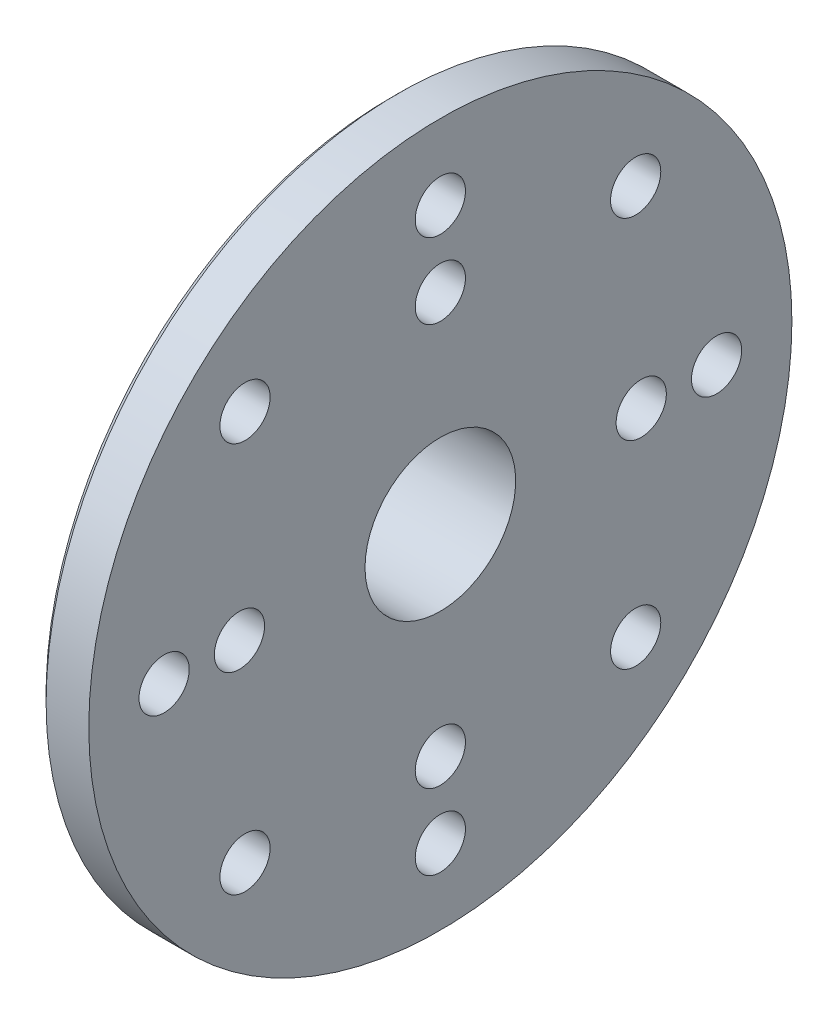
ISO-10303-21;
HEADER;
FILE_DESCRIPTION(('STEP AP214'),'2;1');
FILE_NAME('part.step','',(''),(''),'','','');
FILE_SCHEMA(('AUTOMOTIVE_DESIGN { 1 0 10303 214 1 1 1 1 }'));
ENDSEC;
DATA;
#1=APPLICATION_CONTEXT('core data for automotive mechanical design processes');
#2=APPLICATION_PROTOCOL_DEFINITION('international standard','automotive_design',2000,#1);
#3=PRODUCT_CONTEXT('',#1,'mechanical');
#4=PRODUCT('Part','Part','',(#3));
#5=PRODUCT_RELATED_PRODUCT_CATEGORY('part','',(#4));
#6=PRODUCT_DEFINITION_FORMATION('','',#4);
#7=PRODUCT_DEFINITION_CONTEXT('part definition',#1,'design');
#8=PRODUCT_DEFINITION('design','',#6,#7);
#9=PRODUCT_DEFINITION_SHAPE('','',#8);
#10=(LENGTH_UNIT() NAMED_UNIT(*) SI_UNIT(.MILLI.,.METRE.));
#11=(NAMED_UNIT(*) PLANE_ANGLE_UNIT() SI_UNIT($,.RADIAN.));
#12=(NAMED_UNIT(*) SI_UNIT($,.STERADIAN.) SOLID_ANGLE_UNIT());
#13=UNCERTAINTY_MEASURE_WITH_UNIT(LENGTH_MEASURE(1.E-05),#10,'distance_accuracy_value','');
#14=(GEOMETRIC_REPRESENTATION_CONTEXT(3) GLOBAL_UNCERTAINTY_ASSIGNED_CONTEXT((#13)) GLOBAL_UNIT_ASSIGNED_CONTEXT((#10,
#11,#12)) REPRESENTATION_CONTEXT('',''));
#15=CARTESIAN_POINT('',(0.,0.,0.));
#16=DIRECTION('',(0.,0.,1.));
#17=DIRECTION('',(1.,0.,0.));
#18=AXIS2_PLACEMENT_3D('',#15,#16,#17);
#19=CARTESIAN_POINT('',(-5.,1.5,0.));
#20=DIRECTION('',(1.,0.,0.));
#21=DIRECTION('',(0.,0.,-1.));
#22=AXIS2_PLACEMENT_3D('',#19,#20,#21);
#23=PLANE('',#22);
#24=CARTESIAN_POINT('',(-5.,0.,0.));
#25=DIRECTION('',(1.,0.,0.));
#26=DIRECTION('',(0.,0.,-1.));
#27=AXIS2_PLACEMENT_3D('',#24,#25,#26);
#28=CIRCLE('',#27,3.45000000000001);
#29=CARTESIAN_POINT('',(-5.,0.,-3.45000000000001));
#30=VERTEX_POINT('',#29);
#31=EDGE_CURVE('E10',#30,#30,#28,.F.);
#32=ORIENTED_EDGE('',*,*,#31,.T.);
#33=EDGE_LOOP('',(#32));
#34=FACE_BOUND('',#33,.T.);
#35=CARTESIAN_POINT('',(-5.,0.,0.));
#36=DIRECTION('',(-1.,0.,0.));
#37=DIRECTION('',(0.,0.,1.));
#38=AXIS2_PLACEMENT_3D('',#35,#36,#37);
#39=CIRCLE('',#38,1.5);
#40=CARTESIAN_POINT('',(-5.,0.,1.5));
#41=VERTEX_POINT('',#40);
#42=EDGE_CURVE('E140',#41,#41,#39,.T.);
#43=ORIENTED_EDGE('',*,*,#42,.F.);
#44=EDGE_LOOP('',(#43));
#45=FACE_BOUND('',#44,.T.);
#46=ADVANCED_FACE('F30',(#34,#45),#23,.F.);
#47=CARTESIAN_POINT('',(0.,0.,0.));
#48=DIRECTION('',(-1.,0.,0.));
#49=DIRECTION('',(0.,0.,1.));
#50=AXIS2_PLACEMENT_3D('',#47,#48,#49);
#51=CYLINDRICAL_SURFACE('',#50,3.75);
#52=CARTESIAN_POINT('',(-2.3,0.,0.));
#53=DIRECTION('',(1.,0.,0.));
#54=DIRECTION('',(0.,0.,-1.));
#55=AXIS2_PLACEMENT_3D('',#52,#53,#54);
#56=CIRCLE('',#55,3.75);
#57=CARTESIAN_POINT('',(-2.3,0.,-3.75));
#58=VERTEX_POINT('',#57);
#59=EDGE_CURVE('E77',#58,#58,#56,.F.);
#60=ORIENTED_EDGE('',*,*,#59,.T.);
#61=EDGE_LOOP('',(#60));
#62=FACE_BOUND('',#61,.T.);
#63=CARTESIAN_POINT('',(-4.7,0.,0.));
#64=DIRECTION('',(1.,0.,0.));
#65=DIRECTION('',(0.,0.,-1.));
#66=AXIS2_PLACEMENT_3D('',#63,#64,#65);
#67=CIRCLE('',#66,3.75);
#68=CARTESIAN_POINT('',(-4.7,0.,-3.75));
#69=VERTEX_POINT('',#68);
#70=EDGE_CURVE('E80',#69,#69,#67,.T.);
#71=ORIENTED_EDGE('',*,*,#70,.T.);
#72=EDGE_LOOP('',(#71));
#73=FACE_BOUND('',#72,.T.);
#74=ADVANCED_FACE('F233',(#62,#73),#51,.T.);
#75=CARTESIAN_POINT('',(-2.,3.75,0.));
#76=DIRECTION('',(1.,0.,0.));
#77=DIRECTION('',(0.,0.,-1.));
#78=AXIS2_PLACEMENT_3D('',#75,#76,#77);
#79=PLANE('',#78);
#80=CARTESIAN_POINT('',(-2.,0.,0.));
#81=DIRECTION('',(1.,0.,0.));
#82=DIRECTION('',(0.,0.,-1.));
#83=AXIS2_PLACEMENT_3D('',#80,#81,#82);
#84=CIRCLE('',#83,13.7);
#85=CARTESIAN_POINT('',(-2.,0.,-13.7));
#86=VERTEX_POINT('',#85);
#87=EDGE_CURVE('E86',#86,#86,#84,.F.);
#88=ORIENTED_EDGE('',*,*,#87,.T.);
#89=EDGE_LOOP('',(#88));
#90=FACE_BOUND('',#89,.T.);
#91=CARTESIAN_POINT('',(-2.,0.,0.));
#92=DIRECTION('',(1.,0.,0.));
#93=DIRECTION('',(0.,0.,-1.));
#94=AXIS2_PLACEMENT_3D('',#91,#92,#93);
#95=CIRCLE('',#94,4.05);
#96=CARTESIAN_POINT('',(-2.,0.,-4.05));
#97=VERTEX_POINT('',#96);
#98=EDGE_CURVE('E89',#97,#97,#95,.T.);
#99=ORIENTED_EDGE('',*,*,#98,.T.);
#100=EDGE_LOOP('',(#99));
#101=FACE_BOUND('',#100,.T.);
#102=CARTESIAN_POINT('',(-2.,11.,0.));
#103=DIRECTION('',(1.,0.,0.));
#104=DIRECTION('',(0.,0.,-1.));
#105=AXIS2_PLACEMENT_3D('',#102,#103,#104);
#106=CIRCLE('',#105,1.3);
#107=CARTESIAN_POINT('',(-2.,11.,-1.3));
#108=VERTEX_POINT('',#107);
#109=EDGE_CURVE('E92',#108,#108,#106,.T.);
#110=ORIENTED_EDGE('',*,*,#109,.T.);
#111=EDGE_LOOP('',(#110));
#112=FACE_BOUND('',#111,.T.);
#113=CARTESIAN_POINT('',(-2.,7.77817459305201,-7.77817459305204));
#114=DIRECTION('',(1.,0.,0.));
#115=DIRECTION('',(0.,0.,-1.));
#116=AXIS2_PLACEMENT_3D('',#113,#114,#115);
#117=CIRCLE('',#116,1.3);
#118=CARTESIAN_POINT('',(-2.,7.77817459305201,-9.07817459305203));
#119=VERTEX_POINT('',#118);
#120=EDGE_CURVE('E95',#119,#119,#117,.T.);
#121=ORIENTED_EDGE('',*,*,#120,.T.);
#122=EDGE_LOOP('',(#121));
#123=FACE_BOUND('',#122,.T.);
#124=CARTESIAN_POINT('',(-2.,0.,-11.));
#125=DIRECTION('',(1.,0.,0.));
#126=DIRECTION('',(0.,0.,-1.));
#127=AXIS2_PLACEMENT_3D('',#124,#125,#126);
#128=CIRCLE('',#127,1.30000000000001);
#129=CARTESIAN_POINT('',(-2.,0.,-12.3));
#130=VERTEX_POINT('',#129);
#131=EDGE_CURVE('E98',#130,#130,#128,.T.);
#132=ORIENTED_EDGE('',*,*,#131,.T.);
#133=EDGE_LOOP('',(#132));
#134=FACE_BOUND('',#133,.T.);
#135=CARTESIAN_POINT('',(-2.,-7.77817459305206,-7.77817459305198));
#136=DIRECTION('',(1.,0.,0.));
#137=DIRECTION('',(0.,0.,-1.));
#138=AXIS2_PLACEMENT_3D('',#135,#136,#137);
#139=CIRCLE('',#138,1.3);
#140=CARTESIAN_POINT('',(-2.,-7.77817459305206,-9.07817459305198));
#141=VERTEX_POINT('',#140);
#142=EDGE_CURVE('E101',#141,#141,#139,.T.);
#143=ORIENTED_EDGE('',*,*,#142,.T.);
#144=EDGE_LOOP('',(#143));
#145=FACE_BOUND('',#144,.T.);
#146=CARTESIAN_POINT('',(-2.,-11.,0.));
#147=DIRECTION('',(1.,0.,0.));
#148=DIRECTION('',(0.,0.,-1.));
#149=AXIS2_PLACEMENT_3D('',#146,#147,#148);
#150=CIRCLE('',#149,1.3);
#151=CARTESIAN_POINT('',(-2.,-11.,-1.3));
#152=VERTEX_POINT('',#151);
#153=EDGE_CURVE('E104',#152,#152,#150,.T.);
#154=ORIENTED_EDGE('',*,*,#153,.T.);
#155=EDGE_LOOP('',(#154));
#156=FACE_BOUND('',#155,.T.);
#157=CARTESIAN_POINT('',(-2.,-7.77817459305195,7.77817459305209));
#158=DIRECTION('',(1.,0.,0.));
#159=DIRECTION('',(0.,0.,-1.));
#160=AXIS2_PLACEMENT_3D('',#157,#158,#159);
#161=CIRCLE('',#160,1.30000000000001);
#162=CARTESIAN_POINT('',(-2.,-7.77817459305195,6.47817459305208));
#163=VERTEX_POINT('',#162);
#164=EDGE_CURVE('E107',#163,#163,#161,.T.);
#165=ORIENTED_EDGE('',*,*,#164,.T.);
#166=EDGE_LOOP('',(#165));
#167=FACE_BOUND('',#166,.T.);
#168=CARTESIAN_POINT('',(-2.,1.15218884181823E-13,11.));
#169=DIRECTION('',(1.,0.,0.));
#170=DIRECTION('',(0.,0.,-1.));
#171=AXIS2_PLACEMENT_3D('',#168,#169,#170);
#172=CIRCLE('',#171,1.30000000000001);
#173=CARTESIAN_POINT('',(-2.,1.15218884181823E-13,9.69999999999999));
#174=VERTEX_POINT('',#173);
#175=EDGE_CURVE('E110',#174,#174,#172,.T.);
#176=ORIENTED_EDGE('',*,*,#175,.T.);
#177=EDGE_LOOP('',(#176));
#178=FACE_BOUND('',#177,.T.);
#179=CARTESIAN_POINT('',(-2.,7.77817459305212,7.77817459305193));
#180=DIRECTION('',(1.,0.,0.));
#181=DIRECTION('',(0.,0.,-1.));
#182=AXIS2_PLACEMENT_3D('',#179,#180,#181);
#183=CIRCLE('',#182,1.3);
#184=CARTESIAN_POINT('',(-2.,7.77817459305212,6.47817459305193));
#185=VERTEX_POINT('',#184);
#186=EDGE_CURVE('E113',#185,#185,#183,.T.);
#187=ORIENTED_EDGE('',*,*,#186,.T.);
#188=EDGE_LOOP('',(#187));
#189=FACE_BOUND('',#188,.T.);
#190=CARTESIAN_POINT('',(-2.,8.,0.));
#191=DIRECTION('',(1.,0.,0.));
#192=DIRECTION('',(0.,0.,-1.));
#193=AXIS2_PLACEMENT_3D('',#190,#191,#192);
#194=CIRCLE('',#193,1.3);
#195=CARTESIAN_POINT('',(-2.,8.,-1.3));
#196=VERTEX_POINT('',#195);
#197=EDGE_CURVE('E116',#196,#196,#194,.T.);
#198=ORIENTED_EDGE('',*,*,#197,.T.);
#199=EDGE_LOOP('',(#198));
#200=FACE_BOUND('',#199,.T.);
#201=CARTESIAN_POINT('',(-2.,0.,-8.));
#202=DIRECTION('',(1.,0.,0.));
#203=DIRECTION('',(0.,0.,-1.));
#204=AXIS2_PLACEMENT_3D('',#201,#202,#203);
#205=CIRCLE('',#204,1.3);
#206=CARTESIAN_POINT('',(-2.,0.,-9.3));
#207=VERTEX_POINT('',#206);
#208=EDGE_CURVE('E119',#207,#207,#205,.T.);
#209=ORIENTED_EDGE('',*,*,#208,.T.);
#210=EDGE_LOOP('',(#209));
#211=FACE_BOUND('',#210,.T.);
#212=CARTESIAN_POINT('',(-2.,-8.,0.));
#213=DIRECTION('',(1.,0.,0.));
#214=DIRECTION('',(0.,0.,-1.));
#215=AXIS2_PLACEMENT_3D('',#212,#213,#214);
#216=CIRCLE('',#215,1.3);
#217=CARTESIAN_POINT('',(-2.,-8.,-1.3));
#218=VERTEX_POINT('',#217);
#219=EDGE_CURVE('E122',#218,#218,#216,.T.);
#220=ORIENTED_EDGE('',*,*,#219,.T.);
#221=EDGE_LOOP('',(#220));
#222=FACE_BOUND('',#221,.T.);
#223=CARTESIAN_POINT('',(-2.,0.,8.));
#224=DIRECTION('',(1.,0.,0.));
#225=DIRECTION('',(0.,0.,-1.));
#226=AXIS2_PLACEMENT_3D('',#223,#224,#225);
#227=CIRCLE('',#226,1.3);
#228=CARTESIAN_POINT('',(-2.,0.,6.7));
#229=VERTEX_POINT('',#228);
#230=EDGE_CURVE('E125',#229,#229,#227,.T.);
#231=ORIENTED_EDGE('',*,*,#230,.T.);
#232=EDGE_LOOP('',(#231));
#233=FACE_BOUND('',#232,.T.);
#234=ADVANCED_FACE('F238',(#90,#101,#112,#123,#134,#145,#156,#167,#178,#189,#200,#211,#222,
#233),#79,.F.);
#235=CARTESIAN_POINT('',(0.,0.,0.));
#236=DIRECTION('',(-1.,0.,0.));
#237=DIRECTION('',(0.,0.,1.));
#238=AXIS2_PLACEMENT_3D('',#235,#236,#237);
#239=CYLINDRICAL_SURFACE('',#238,14.);
#240=CARTESIAN_POINT('',(-1.7,0.,0.));
#241=DIRECTION('',(1.,0.,0.));
#242=DIRECTION('',(0.,0.,-1.));
#243=AXIS2_PLACEMENT_3D('',#240,#241,#242);
#244=CIRCLE('',#243,14.);
#245=CARTESIAN_POINT('',(-1.7,0.,-14.));
#246=VERTEX_POINT('',#245);
#247=EDGE_CURVE('E83',#246,#246,#244,.T.);
#248=ORIENTED_EDGE('',*,*,#247,.T.);
#249=EDGE_LOOP('',(#248));
#250=FACE_BOUND('',#249,.T.);
#251=CARTESIAN_POINT('',(0.,0.,0.));
#252=DIRECTION('',(-1.,0.,0.));
#253=DIRECTION('',(0.,0.,1.));
#254=AXIS2_PLACEMENT_3D('',#251,#252,#253);
#255=CIRCLE('',#254,14.);
#256=CARTESIAN_POINT('',(0.,0.,14.));
#257=VERTEX_POINT('',#256);
#258=EDGE_CURVE('E128',#257,#257,#255,.T.);
#259=ORIENTED_EDGE('',*,*,#258,.T.);
#260=EDGE_LOOP('',(#259));
#261=FACE_BOUND('',#260,.T.);
#262=ADVANCED_FACE('F186',(#250,#261),#239,.T.);
#263=CARTESIAN_POINT('',(0.,14.,0.));
#264=DIRECTION('',(-1.,0.,0.));
#265=DIRECTION('',(0.,0.,1.));
#266=AXIS2_PLACEMENT_3D('',#263,#264,#265);
#267=PLANE('',#266);
#268=CARTESIAN_POINT('',(0.,0.,8.));
#269=DIRECTION('',(1.,0.,0.));
#270=DIRECTION('',(0.,1.,0.));
#271=AXIS2_PLACEMENT_3D('',#268,#269,#270);
#272=CIRCLE('',#271,1.);
#273=CARTESIAN_POINT('',(0.,1.00000000000008,7.99999999999999));
#274=VERTEX_POINT('',#273);
#275=EDGE_CURVE('E176',#274,#274,#272,.T.);
#276=ORIENTED_EDGE('',*,*,#275,.F.);
#277=EDGE_LOOP('',(#276));
#278=FACE_BOUND('',#277,.T.);
#279=CARTESIAN_POINT('',(0.,-8.,0.));
#280=DIRECTION('',(1.,0.,0.));
#281=DIRECTION('',(0.,0.,1.));
#282=AXIS2_PLACEMENT_3D('',#279,#280,#281);
#283=CIRCLE('',#282,1.);
#284=CARTESIAN_POINT('',(0.,-8.,1.));
#285=VERTEX_POINT('',#284);
#286=EDGE_CURVE('E173',#285,#285,#283,.T.);
#287=ORIENTED_EDGE('',*,*,#286,.F.);
#288=EDGE_LOOP('',(#287));
#289=FACE_BOUND('',#288,.T.);
#290=CARTESIAN_POINT('',(0.,0.,-8.));
#291=DIRECTION('',(1.,0.,0.));
#292=DIRECTION('',(0.,-1.,0.));
#293=AXIS2_PLACEMENT_3D('',#290,#291,#292);
#294=CIRCLE('',#293,1.);
#295=CARTESIAN_POINT('',(0.,-1.00000000000003,-8.));
#296=VERTEX_POINT('',#295);
#297=EDGE_CURVE('E170',#296,#296,#294,.T.);
#298=ORIENTED_EDGE('',*,*,#297,.F.);
#299=EDGE_LOOP('',(#298));
#300=FACE_BOUND('',#299,.T.);
#301=CARTESIAN_POINT('',(0.,8.,0.));
#302=DIRECTION('',(1.,0.,0.));
#303=DIRECTION('',(0.,0.,-1.));
#304=AXIS2_PLACEMENT_3D('',#301,#302,#303);
#305=CIRCLE('',#304,1.);
#306=CARTESIAN_POINT('',(0.,8.,-1.));
#307=VERTEX_POINT('',#306);
#308=EDGE_CURVE('E167',#307,#307,#305,.T.);
#309=ORIENTED_EDGE('',*,*,#308,.F.);
#310=EDGE_LOOP('',(#309));
#311=FACE_BOUND('',#310,.T.);
#312=CARTESIAN_POINT('',(0.,7.77817459305212,7.77817459305193));
#313=DIRECTION('',(1.,0.,0.));
#314=DIRECTION('',(0.,0.707106781186539,-0.707106781186556));
#315=AXIS2_PLACEMENT_3D('',#312,#313,#314);
#316=CIRCLE('',#315,1.);
#317=CARTESIAN_POINT('',(0.,8.48528137423866,7.07106781186537));
#318=VERTEX_POINT('',#317);
#319=EDGE_CURVE('E164',#318,#318,#316,.T.);
#320=ORIENTED_EDGE('',*,*,#319,.F.);
#321=EDGE_LOOP('',(#320));
#322=FACE_BOUND('',#321,.T.);
#323=CARTESIAN_POINT('',(0.,1.15218884181823E-13,11.));
#324=DIRECTION('',(1.,0.,0.));
#325=DIRECTION('',(0.,1.,0.));
#326=AXIS2_PLACEMENT_3D('',#323,#324,#325);
#327=CIRCLE('',#326,1.);
#328=CARTESIAN_POINT('',(0.,1.00000000000012,11.));
#329=VERTEX_POINT('',#328);
#330=EDGE_CURVE('E161',#329,#329,#327,.T.);
#331=ORIENTED_EDGE('',*,*,#330,.F.);
#332=EDGE_LOOP('',(#331));
#333=FACE_BOUND('',#332,.T.);
#334=CARTESIAN_POINT('',(0.,-7.77817459305195,7.77817459305209));
#335=DIRECTION('',(1.,0.,0.));
#336=DIRECTION('',(0.,0.707106781186554,0.707106781186541));
#337=AXIS2_PLACEMENT_3D('',#334,#335,#336);
#338=CIRCLE('',#337,1.);
#339=CARTESIAN_POINT('',(0.,-7.0710678118654,8.48528137423863));
#340=VERTEX_POINT('',#339);
#341=EDGE_CURVE('E158',#340,#340,#338,.T.);
#342=ORIENTED_EDGE('',*,*,#341,.F.);
#343=EDGE_LOOP('',(#342));
#344=FACE_BOUND('',#343,.T.);
#345=CARTESIAN_POINT('',(0.,-11.,0.));
#346=DIRECTION('',(1.,0.,0.));
#347=DIRECTION('',(0.,0.,1.));
#348=AXIS2_PLACEMENT_3D('',#345,#346,#347);
#349=CIRCLE('',#348,1.);
#350=CARTESIAN_POINT('',(0.,-11.,1.));
#351=VERTEX_POINT('',#350);
#352=EDGE_CURVE('E155',#351,#351,#349,.T.);
#353=ORIENTED_EDGE('',*,*,#352,.F.);
#354=EDGE_LOOP('',(#353));
#355=FACE_BOUND('',#354,.T.);
#356=CARTESIAN_POINT('',(0.,-7.77817459305206,-7.77817459305198));
#357=DIRECTION('',(1.,0.,0.));
#358=DIRECTION('',(0.,-0.707106781186544,0.707106781186551));
#359=AXIS2_PLACEMENT_3D('',#356,#357,#358);
#360=CIRCLE('',#359,1.);
#361=CARTESIAN_POINT('',(0.,-8.48528137423861,-7.07106781186543));
#362=VERTEX_POINT('',#361);
#363=EDGE_CURVE('E152',#362,#362,#360,.T.);
#364=ORIENTED_EDGE('',*,*,#363,.F.);
#365=EDGE_LOOP('',(#364));
#366=FACE_BOUND('',#365,.T.);
#367=CARTESIAN_POINT('',(0.,0.,-11.));
#368=DIRECTION('',(1.,0.,0.));
#369=DIRECTION('',(0.,-1.,0.));
#370=AXIS2_PLACEMENT_3D('',#367,#368,#369);
#371=CIRCLE('',#370,1.);
#372=CARTESIAN_POINT('',(0.,-1.00000000000004,-11.));
#373=VERTEX_POINT('',#372);
#374=EDGE_CURVE('E149',#373,#373,#371,.T.);
#375=ORIENTED_EDGE('',*,*,#374,.F.);
#376=EDGE_LOOP('',(#375));
#377=FACE_BOUND('',#376,.T.);
#378=CARTESIAN_POINT('',(0.,7.77817459305201,-7.77817459305204));
#379=DIRECTION('',(1.,0.,0.));
#380=DIRECTION('',(0.,-0.707106781186549,-0.707106781186546));
#381=AXIS2_PLACEMENT_3D('',#378,#379,#380);
#382=CIRCLE('',#381,1.);
#383=CARTESIAN_POINT('',(0.,7.07106781186546,-8.48528137423858));
#384=VERTEX_POINT('',#383);
#385=EDGE_CURVE('E146',#384,#384,#382,.T.);
#386=ORIENTED_EDGE('',*,*,#385,.F.);
#387=EDGE_LOOP('',(#386));
#388=FACE_BOUND('',#387,.T.);
#389=CARTESIAN_POINT('',(0.,11.,0.));
#390=DIRECTION('',(1.,0.,0.));
#391=DIRECTION('',(0.,0.,-1.));
#392=AXIS2_PLACEMENT_3D('',#389,#390,#391);
#393=CIRCLE('',#392,1.);
#394=CARTESIAN_POINT('',(0.,11.,-1.));
#395=VERTEX_POINT('',#394);
#396=EDGE_CURVE('E143',#395,#395,#393,.T.);
#397=ORIENTED_EDGE('',*,*,#396,.F.);
#398=EDGE_LOOP('',(#397));
#399=FACE_BOUND('',#398,.T.);
#400=ORIENTED_EDGE('',*,*,#258,.F.);
#401=EDGE_LOOP('',(#400));
#402=FACE_BOUND('',#401,.T.);
#403=CARTESIAN_POINT('',(0.,0.,0.));
#404=DIRECTION('',(-1.,0.,0.));
#405=DIRECTION('',(0.,0.,1.));
#406=AXIS2_PLACEMENT_3D('',#403,#404,#405);
#407=CIRCLE('',#406,3.);
#408=CARTESIAN_POINT('',(0.,0.,3.));
#409=VERTEX_POINT('',#408);
#410=EDGE_CURVE('E131',#409,#409,#407,.T.);
#411=ORIENTED_EDGE('',*,*,#410,.T.);
#412=EDGE_LOOP('',(#411));
#413=FACE_BOUND('',#412,.T.);
#414=ADVANCED_FACE('F182',(#278,#289,#300,#311,#322,#333,#344,#355,#366,#377,#388,#399,#402,
#413),#267,.F.);
#415=CARTESIAN_POINT('',(0.,0.,0.));
#416=DIRECTION('',(-1.,0.,0.));
#417=DIRECTION('',(0.,0.,1.));
#418=AXIS2_PLACEMENT_3D('',#415,#416,#417);
#419=CYLINDRICAL_SURFACE('',#418,3.);
#420=ORIENTED_EDGE('',*,*,#410,.F.);
#421=EDGE_LOOP('',(#420));
#422=FACE_BOUND('',#421,.T.);
#423=CARTESIAN_POINT('',(-4.5,0.,0.));
#424=DIRECTION('',(-1.,0.,0.));
#425=DIRECTION('',(0.,0.,1.));
#426=AXIS2_PLACEMENT_3D('',#423,#424,#425);
#427=CIRCLE('',#426,3.);
#428=CARTESIAN_POINT('',(-4.5,0.,3.));
#429=VERTEX_POINT('',#428);
#430=EDGE_CURVE('E134',#429,#429,#427,.T.);
#431=ORIENTED_EDGE('',*,*,#430,.T.);
#432=EDGE_LOOP('',(#431));
#433=FACE_BOUND('',#432,.T.);
#434=ADVANCED_FACE('F185',(#422,#433),#419,.F.);
#435=CARTESIAN_POINT('',(-4.5,3.,0.));
#436=DIRECTION('',(-1.,0.,0.));
#437=DIRECTION('',(0.,0.,1.));
#438=AXIS2_PLACEMENT_3D('',#435,#436,#437);
#439=PLANE('',#438);
#440=ORIENTED_EDGE('',*,*,#430,.F.);
#441=EDGE_LOOP('',(#440));
#442=FACE_BOUND('',#441,.T.);
#443=CARTESIAN_POINT('',(-4.5,0.,0.));
#444=DIRECTION('',(-1.,0.,0.));
#445=DIRECTION('',(0.,0.,1.));
#446=AXIS2_PLACEMENT_3D('',#443,#444,#445);
#447=CIRCLE('',#446,1.5);
#448=CARTESIAN_POINT('',(-4.5,0.,1.5));
#449=VERTEX_POINT('',#448);
#450=EDGE_CURVE('E137',#449,#449,#447,.T.);
#451=ORIENTED_EDGE('',*,*,#450,.T.);
#452=EDGE_LOOP('',(#451));
#453=FACE_BOUND('',#452,.T.);
#454=ADVANCED_FACE('F216',(#442,#453),#439,.F.);
#455=CARTESIAN_POINT('',(0.,0.,0.));
#456=DIRECTION('',(-1.,0.,0.));
#457=DIRECTION('',(0.,0.,1.));
#458=AXIS2_PLACEMENT_3D('',#455,#456,#457);
#459=CYLINDRICAL_SURFACE('',#458,1.5);
#460=ORIENTED_EDGE('',*,*,#450,.F.);
#461=EDGE_LOOP('',(#460));
#462=FACE_BOUND('',#461,.T.);
#463=ORIENTED_EDGE('',*,*,#42,.T.);
#464=EDGE_LOOP('',(#463));
#465=FACE_BOUND('',#464,.T.);
#466=ADVANCED_FACE('F222',(#462,#465),#459,.F.);
#467=CARTESIAN_POINT('',(-5.,11.,0.));
#468=DIRECTION('',(1.,0.,0.));
#469=DIRECTION('',(0.,0.,-1.));
#470=AXIS2_PLACEMENT_3D('',#467,#468,#469);
#471=CYLINDRICAL_SURFACE('',#470,1.);
#472=CARTESIAN_POINT('',(-1.7,11.,0.));
#473=DIRECTION('',(1.,0.,0.));
#474=DIRECTION('',(0.,0.,-1.));
#475=AXIS2_PLACEMENT_3D('',#472,#473,#474);
#476=CIRCLE('',#475,1.);
#477=CARTESIAN_POINT('',(-1.7,11.,-1.));
#478=VERTEX_POINT('',#477);
#479=EDGE_CURVE('E74',#478,#478,#476,.F.);
#480=ORIENTED_EDGE('',*,*,#479,.T.);
#481=EDGE_LOOP('',(#480));
#482=FACE_BOUND('',#481,.T.);
#483=ORIENTED_EDGE('',*,*,#396,.T.);
#484=EDGE_LOOP('',(#483));
#485=FACE_BOUND('',#484,.T.);
#486=ADVANCED_FACE('F228',(#482,#485),#471,.F.);
#487=CARTESIAN_POINT('',(-5.,7.77817459305201,-7.77817459305204));
#488=DIRECTION('',(1.,0.,0.));
#489=DIRECTION('',(0.,0.,-1.));
#490=AXIS2_PLACEMENT_3D('',#487,#488,#489);
#491=CYLINDRICAL_SURFACE('',#490,1.);
#492=CARTESIAN_POINT('',(-1.7,7.77817459305201,-7.77817459305204));
#493=DIRECTION('',(1.,0.,0.));
#494=DIRECTION('',(0.,0.,-1.));
#495=AXIS2_PLACEMENT_3D('',#492,#493,#494);
#496=CIRCLE('',#495,1.);
#497=CARTESIAN_POINT('',(-1.7,7.77817459305201,-8.77817459305204));
#498=VERTEX_POINT('',#497);
#499=EDGE_CURVE('E71',#498,#498,#496,.F.);
#500=ORIENTED_EDGE('',*,*,#499,.T.);
#501=EDGE_LOOP('',(#500));
#502=FACE_BOUND('',#501,.T.);
#503=ORIENTED_EDGE('',*,*,#385,.T.);
#504=EDGE_LOOP('',(#503));
#505=FACE_BOUND('',#504,.T.);
#506=ADVANCED_FACE('F315',(#502,#505),#491,.F.);
#507=CARTESIAN_POINT('',(-5.,0.,-11.));
#508=DIRECTION('',(1.,0.,0.));
#509=DIRECTION('',(0.,0.,-1.));
#510=AXIS2_PLACEMENT_3D('',#507,#508,#509);
#511=CYLINDRICAL_SURFACE('',#510,1.);
#512=CARTESIAN_POINT('',(-1.69999999999999,0.,-11.));
#513=DIRECTION('',(1.,0.,0.));
#514=DIRECTION('',(0.,0.,-1.));
#515=AXIS2_PLACEMENT_3D('',#512,#513,#514);
#516=CIRCLE('',#515,1.);
#517=CARTESIAN_POINT('',(-1.69999999999999,0.,-12.));
#518=VERTEX_POINT('',#517);
#519=EDGE_CURVE('E68',#518,#518,#516,.F.);
#520=ORIENTED_EDGE('',*,*,#519,.T.);
#521=EDGE_LOOP('',(#520));
#522=FACE_BOUND('',#521,.T.);
#523=ORIENTED_EDGE('',*,*,#374,.T.);
#524=EDGE_LOOP('',(#523));
#525=FACE_BOUND('',#524,.T.);
#526=ADVANCED_FACE('F319',(#522,#525),#511,.F.);
#527=CARTESIAN_POINT('',(-5.,-7.77817459305206,-7.77817459305198));
#528=DIRECTION('',(1.,0.,0.));
#529=DIRECTION('',(0.,0.,-1.));
#530=AXIS2_PLACEMENT_3D('',#527,#528,#529);
#531=CYLINDRICAL_SURFACE('',#530,1.);
#532=CARTESIAN_POINT('',(-1.7,-7.77817459305206,-7.77817459305198));
#533=DIRECTION('',(1.,0.,0.));
#534=DIRECTION('',(0.,0.,-1.));
#535=AXIS2_PLACEMENT_3D('',#532,#533,#534);
#536=CIRCLE('',#535,1.);
#537=CARTESIAN_POINT('',(-1.7,-7.77817459305206,-8.77817459305198));
#538=VERTEX_POINT('',#537);
#539=EDGE_CURVE('E65',#538,#538,#536,.F.);
#540=ORIENTED_EDGE('',*,*,#539,.T.);
#541=EDGE_LOOP('',(#540));
#542=FACE_BOUND('',#541,.T.);
#543=ORIENTED_EDGE('',*,*,#363,.T.);
#544=EDGE_LOOP('',(#543));
#545=FACE_BOUND('',#544,.T.);
#546=ADVANCED_FACE('F323',(#542,#545),#531,.F.);
#547=CARTESIAN_POINT('',(-5.,-11.,0.));
#548=DIRECTION('',(1.,0.,0.));
#549=DIRECTION('',(0.,0.,-1.));
#550=AXIS2_PLACEMENT_3D('',#547,#548,#549);
#551=CYLINDRICAL_SURFACE('',#550,1.);
#552=CARTESIAN_POINT('',(-1.7,-11.,0.));
#553=DIRECTION('',(1.,0.,0.));
#554=DIRECTION('',(0.,0.,-1.));
#555=AXIS2_PLACEMENT_3D('',#552,#553,#554);
#556=CIRCLE('',#555,1.);
#557=CARTESIAN_POINT('',(-1.7,-11.,-1.));
#558=VERTEX_POINT('',#557);
#559=EDGE_CURVE('E62',#558,#558,#556,.F.);
#560=ORIENTED_EDGE('',*,*,#559,.T.);
#561=EDGE_LOOP('',(#560));
#562=FACE_BOUND('',#561,.T.);
#563=ORIENTED_EDGE('',*,*,#352,.T.);
#564=EDGE_LOOP('',(#563));
#565=FACE_BOUND('',#564,.T.);
#566=ADVANCED_FACE('F327',(#562,#565),#551,.F.);
#567=CARTESIAN_POINT('',(-5.,-7.77817459305195,7.77817459305209));
#568=DIRECTION('',(1.,0.,0.));
#569=DIRECTION('',(0.,0.,-1.));
#570=AXIS2_PLACEMENT_3D('',#567,#568,#569);
#571=CYLINDRICAL_SURFACE('',#570,1.);
#572=CARTESIAN_POINT('',(-1.69999999999999,-7.77817459305195,7.77817459305209));
#573=DIRECTION('',(1.,0.,0.));
#574=DIRECTION('',(0.,0.,-1.));
#575=AXIS2_PLACEMENT_3D('',#572,#573,#574);
#576=CIRCLE('',#575,1.);
#577=CARTESIAN_POINT('',(-1.69999999999999,-7.77817459305195,6.77817459305209));
#578=VERTEX_POINT('',#577);
#579=EDGE_CURVE('E59',#578,#578,#576,.F.);
#580=ORIENTED_EDGE('',*,*,#579,.T.);
#581=EDGE_LOOP('',(#580));
#582=FACE_BOUND('',#581,.T.);
#583=ORIENTED_EDGE('',*,*,#341,.T.);
#584=EDGE_LOOP('',(#583));
#585=FACE_BOUND('',#584,.T.);
#586=ADVANCED_FACE('F331',(#582,#585),#571,.F.);
#587=CARTESIAN_POINT('',(-5.,1.15218884181823E-13,11.));
#588=DIRECTION('',(1.,0.,0.));
#589=DIRECTION('',(0.,0.,-1.));
#590=AXIS2_PLACEMENT_3D('',#587,#588,#589);
#591=CYLINDRICAL_SURFACE('',#590,1.);
#592=CARTESIAN_POINT('',(-1.69999999999999,1.15218884181823E-13,11.));
#593=DIRECTION('',(1.,0.,0.));
#594=DIRECTION('',(0.,0.,-1.));
#595=AXIS2_PLACEMENT_3D('',#592,#593,#594);
#596=CIRCLE('',#595,1.);
#597=CARTESIAN_POINT('',(-1.69999999999999,1.15218884181823E-13,10.));
#598=VERTEX_POINT('',#597);
#599=EDGE_CURVE('E56',#598,#598,#596,.F.);
#600=ORIENTED_EDGE('',*,*,#599,.T.);
#601=EDGE_LOOP('',(#600));
#602=FACE_BOUND('',#601,.T.);
#603=ORIENTED_EDGE('',*,*,#330,.T.);
#604=EDGE_LOOP('',(#603));
#605=FACE_BOUND('',#604,.T.);
#606=ADVANCED_FACE('F335',(#602,#605),#591,.F.);
#607=CARTESIAN_POINT('',(-5.,7.77817459305212,7.77817459305193));
#608=DIRECTION('',(1.,0.,0.));
#609=DIRECTION('',(0.,0.,-1.));
#610=AXIS2_PLACEMENT_3D('',#607,#608,#609);
#611=CYLINDRICAL_SURFACE('',#610,1.);
#612=CARTESIAN_POINT('',(-1.7,7.77817459305212,7.77817459305193));
#613=DIRECTION('',(1.,0.,0.));
#614=DIRECTION('',(0.,0.,-1.));
#615=AXIS2_PLACEMENT_3D('',#612,#613,#614);
#616=CIRCLE('',#615,1.);
#617=CARTESIAN_POINT('',(-1.7,7.77817459305212,6.77817459305193));
#618=VERTEX_POINT('',#617);
#619=EDGE_CURVE('E53',#618,#618,#616,.F.);
#620=ORIENTED_EDGE('',*,*,#619,.T.);
#621=EDGE_LOOP('',(#620));
#622=FACE_BOUND('',#621,.T.);
#623=ORIENTED_EDGE('',*,*,#319,.T.);
#624=EDGE_LOOP('',(#623));
#625=FACE_BOUND('',#624,.T.);
#626=ADVANCED_FACE('F339',(#622,#625),#611,.F.);
#627=CARTESIAN_POINT('',(-5.,8.,0.));
#628=DIRECTION('',(1.,0.,0.));
#629=DIRECTION('',(0.,0.,-1.));
#630=AXIS2_PLACEMENT_3D('',#627,#628,#629);
#631=CYLINDRICAL_SURFACE('',#630,1.);
#632=CARTESIAN_POINT('',(-1.7,8.,0.));
#633=DIRECTION('',(1.,0.,0.));
#634=DIRECTION('',(0.,0.,-1.));
#635=AXIS2_PLACEMENT_3D('',#632,#633,#634);
#636=CIRCLE('',#635,1.);
#637=CARTESIAN_POINT('',(-1.7,8.,-1.));
#638=VERTEX_POINT('',#637);
#639=EDGE_CURVE('E50',#638,#638,#636,.F.);
#640=ORIENTED_EDGE('',*,*,#639,.T.);
#641=EDGE_LOOP('',(#640));
#642=FACE_BOUND('',#641,.T.);
#643=ORIENTED_EDGE('',*,*,#308,.T.);
#644=EDGE_LOOP('',(#643));
#645=FACE_BOUND('',#644,.T.);
#646=ADVANCED_FACE('F343',(#642,#645),#631,.F.);
#647=CARTESIAN_POINT('',(-5.,0.,-8.));
#648=DIRECTION('',(1.,0.,0.));
#649=DIRECTION('',(0.,0.,-1.));
#650=AXIS2_PLACEMENT_3D('',#647,#648,#649);
#651=CYLINDRICAL_SURFACE('',#650,1.);
#652=CARTESIAN_POINT('',(-1.7,0.,-8.));
#653=DIRECTION('',(1.,0.,0.));
#654=DIRECTION('',(0.,0.,-1.));
#655=AXIS2_PLACEMENT_3D('',#652,#653,#654);
#656=CIRCLE('',#655,1.);
#657=CARTESIAN_POINT('',(-1.7,0.,-9.));
#658=VERTEX_POINT('',#657);
#659=EDGE_CURVE('E45',#658,#658,#656,.F.);
#660=ORIENTED_EDGE('',*,*,#659,.T.);
#661=EDGE_LOOP('',(#660));
#662=FACE_BOUND('',#661,.T.);
#663=ORIENTED_EDGE('',*,*,#297,.T.);
#664=EDGE_LOOP('',(#663));
#665=FACE_BOUND('',#664,.T.);
#666=ADVANCED_FACE('F347',(#662,#665),#651,.F.);
#667=CARTESIAN_POINT('',(-5.,-8.,0.));
#668=DIRECTION('',(1.,0.,0.));
#669=DIRECTION('',(0.,0.,-1.));
#670=AXIS2_PLACEMENT_3D('',#667,#668,#669);
#671=CYLINDRICAL_SURFACE('',#670,1.);
#672=CARTESIAN_POINT('',(-1.7,-8.,0.));
#673=DIRECTION('',(1.,0.,0.));
#674=DIRECTION('',(0.,0.,-1.));
#675=AXIS2_PLACEMENT_3D('',#672,#673,#674);
#676=CIRCLE('',#675,1.);
#677=CARTESIAN_POINT('',(-1.7,-8.,-1.));
#678=VERTEX_POINT('',#677);
#679=EDGE_CURVE('E41',#678,#678,#676,.F.);
#680=ORIENTED_EDGE('',*,*,#679,.T.);
#681=EDGE_LOOP('',(#680));
#682=FACE_BOUND('',#681,.T.);
#683=ORIENTED_EDGE('',*,*,#286,.T.);
#684=EDGE_LOOP('',(#683));
#685=FACE_BOUND('',#684,.T.);
#686=ADVANCED_FACE('F351',(#682,#685),#671,.F.);
#687=CARTESIAN_POINT('',(-5.,0.,8.));
#688=DIRECTION('',(1.,0.,0.));
#689=DIRECTION('',(0.,0.,-1.));
#690=AXIS2_PLACEMENT_3D('',#687,#688,#689);
#691=CYLINDRICAL_SURFACE('',#690,1.);
#692=CARTESIAN_POINT('',(-1.7,0.,8.));
#693=DIRECTION('',(1.,0.,0.));
#694=DIRECTION('',(0.,0.,-1.));
#695=AXIS2_PLACEMENT_3D('',#692,#693,#694);
#696=CIRCLE('',#695,1.);
#697=CARTESIAN_POINT('',(-1.7,0.,7.));
#698=VERTEX_POINT('',#697);
#699=EDGE_CURVE('E37',#698,#698,#696,.F.);
#700=ORIENTED_EDGE('',*,*,#699,.T.);
#701=EDGE_LOOP('',(#700));
#702=FACE_BOUND('',#701,.T.);
#703=ORIENTED_EDGE('',*,*,#275,.T.);
#704=EDGE_LOOP('',(#703));
#705=FACE_BOUND('',#704,.T.);
#706=ADVANCED_FACE('F180',(#702,#705),#691,.F.);
#707=CARTESIAN_POINT('',(-2.,0.,0.));
#708=DIRECTION('',(1.,0.,0.));
#709=DIRECTION('',(0.,0.,-1.));
#710=AXIS2_PLACEMENT_3D('',#707,#708,#709);
#711=CONICAL_SURFACE('',#710,13.7,0.785398163397443);
#712=ORIENTED_EDGE('',*,*,#247,.F.);
#713=EDGE_LOOP('',(#712));
#714=FACE_BOUND('',#713,.T.);
#715=ORIENTED_EDGE('',*,*,#87,.F.);
#716=EDGE_LOOP('',(#715));
#717=FACE_BOUND('',#716,.T.);
#718=ADVANCED_FACE('F243',(#714,#717),#711,.T.);
#719=CARTESIAN_POINT('',(-2.3,0.,0.));
#720=DIRECTION('',(1.,0.,0.));
#721=DIRECTION('',(0.,0.,-1.));
#722=AXIS2_PLACEMENT_3D('',#719,#720,#721);
#723=CONICAL_SURFACE('',#722,3.75,0.785398163397448);
#724=CARTESIAN_POINT('',(-2.,0.,-4.05));
#725=CARTESIAN_POINT('',(-2.003125,0.,-4.046875));
#726=CARTESIAN_POINT('',(-2.00625,0.,-4.04375));
#727=CARTESIAN_POINT('',(-2.0125,0.,-4.0375));
#728=CARTESIAN_POINT('',(-2.015625,0.,-4.034375));
#729=CARTESIAN_POINT('',(-2.021875,0.,-4.028125));
#730=CARTESIAN_POINT('',(-2.025,0.,-4.025));
#731=CARTESIAN_POINT('',(-2.03125,0.,-4.01875));
#732=CARTESIAN_POINT('',(-2.034375,0.,-4.015625));
#733=CARTESIAN_POINT('',(-2.040625,0.,-4.009375));
#734=CARTESIAN_POINT('',(-2.04375,0.,-4.00625));
#735=CARTESIAN_POINT('',(-2.05,0.,-4.));
#736=CARTESIAN_POINT('',(-2.053125,0.,-3.996875));
#737=CARTESIAN_POINT('',(-2.059375,0.,-3.990625));
#738=CARTESIAN_POINT('',(-2.0625,0.,-3.9875));
#739=CARTESIAN_POINT('',(-2.06875,0.,-3.98125));
#740=CARTESIAN_POINT('',(-2.071875,0.,-3.978125));
#741=CARTESIAN_POINT('',(-2.078125,0.,-3.971875));
#742=CARTESIAN_POINT('',(-2.08125,0.,-3.96875));
#743=CARTESIAN_POINT('',(-2.0875,0.,-3.9625));
#744=CARTESIAN_POINT('',(-2.090625,0.,-3.959375));
#745=CARTESIAN_POINT('',(-2.096875,0.,-3.953125));
#746=CARTESIAN_POINT('',(-2.1,0.,-3.95));
#747=CARTESIAN_POINT('',(-2.10625,0.,-3.94375));
#748=CARTESIAN_POINT('',(-2.109375,0.,-3.940625));
#749=CARTESIAN_POINT('',(-2.115625,0.,-3.934375));
#750=CARTESIAN_POINT('',(-2.11875,0.,-3.93125));
#751=CARTESIAN_POINT('',(-2.125,0.,-3.925));
#752=CARTESIAN_POINT('',(-2.128125,0.,-3.921875));
#753=CARTESIAN_POINT('',(-2.134375,0.,-3.915625));
#754=CARTESIAN_POINT('',(-2.1375,0.,-3.9125));
#755=CARTESIAN_POINT('',(-2.14375,0.,-3.90625));
#756=CARTESIAN_POINT('',(-2.146875,0.,-3.903125));
#757=CARTESIAN_POINT('',(-2.153125,0.,-3.896875));
#758=CARTESIAN_POINT('',(-2.15625,0.,-3.89375));
#759=CARTESIAN_POINT('',(-2.1625,0.,-3.8875));
#760=CARTESIAN_POINT('',(-2.165625,0.,-3.884375));
#761=CARTESIAN_POINT('',(-2.171875,0.,-3.878125));
#762=CARTESIAN_POINT('',(-2.175,0.,-3.875));
#763=CARTESIAN_POINT('',(-2.18125,0.,-3.86875));
#764=CARTESIAN_POINT('',(-2.184375,0.,-3.865625));
#765=CARTESIAN_POINT('',(-2.190625,0.,-3.859375));
#766=CARTESIAN_POINT('',(-2.19375,0.,-3.85625));
#767=CARTESIAN_POINT('',(-2.2,0.,-3.85));
#768=CARTESIAN_POINT('',(-2.203125,0.,-3.846875));
#769=CARTESIAN_POINT('',(-2.209375,0.,-3.840625));
#770=CARTESIAN_POINT('',(-2.2125,0.,-3.8375));
#771=CARTESIAN_POINT('',(-2.21875,0.,-3.83125));
#772=CARTESIAN_POINT('',(-2.221875,0.,-3.828125));
#773=CARTESIAN_POINT('',(-2.228125,0.,-3.821875));
#774=CARTESIAN_POINT('',(-2.23125,0.,-3.81875));
#775=CARTESIAN_POINT('',(-2.2375,0.,-3.8125));
#776=CARTESIAN_POINT('',(-2.240625,0.,-3.809375));
#777=CARTESIAN_POINT('',(-2.246875,0.,-3.803125));
#778=CARTESIAN_POINT('',(-2.25,0.,-3.8));
#779=CARTESIAN_POINT('',(-2.25625,0.,-3.79375));
#780=CARTESIAN_POINT('',(-2.259375,0.,-3.790625));
#781=CARTESIAN_POINT('',(-2.265625,0.,-3.784375));
#782=CARTESIAN_POINT('',(-2.26875,0.,-3.78125));
#783=CARTESIAN_POINT('',(-2.275,0.,-3.775));
#784=CARTESIAN_POINT('',(-2.278125,0.,-3.771875));
#785=CARTESIAN_POINT('',(-2.284375,0.,-3.765625));
#786=CARTESIAN_POINT('',(-2.2875,0.,-3.7625));
#787=CARTESIAN_POINT('',(-2.29375,0.,-3.75625));
#788=CARTESIAN_POINT('',(-2.296875,0.,-3.753125));
#789=CARTESIAN_POINT('',(-2.3,0.,-3.75));
#790=B_SPLINE_CURVE_WITH_KNOTS('',3,(#724,#725,#726,#727,#728,#729,#730,#731,#732,#733,#734,
#735,#736,#737,#738,#739,#740,#741,#742,#743,#744,#745,#746,#747,#748,#749,#750,#751,#752,#753,
#754,#755,#756,#757,#758,#759,#760,#761,#762,#763,#764,#765,#766,#767,#768,#769,#770,#771,#772,
#773,#774,#775,#776,#777,#778,#779,#780,#781,#782,#783,#784,#785,#786,#787,#788,#789),
.UNSPECIFIED.,.F.,.F.,(4,2,2,2,2,2,2,2,2,2,2,2,2,2,2,2,2,2,2,2,2,2,2,2,2,2,2,2,2,2,2,2,4),(0.,
0.0132582521472475,0.0265165042944951,0.0397747564417435,0.0530330085889911,0.0662912607362386,
0.0795495128834861,0.092807765030734,0.106066017177982,0.119324269325229,0.132582521472477,
0.145840773619725,0.159099025766973,0.17235727791422,0.185615530061468,0.198873782208715,
0.212132034355963,0.225390286503211,0.238648538650459,0.251906790797706,0.265165042944954,
0.278423295092202,0.291681547239449,0.304939799386697,0.318198051533945,0.331456303681193,
0.34471455582844,0.357972807975688,0.371231060122935,0.384489312270183,0.397747564417431,
0.411005816564678,0.424264068711926),.UNSPECIFIED.);
#791=EDGE_CURVE('BSEAM246',#97,#58,#790,.T.);
#792=ORIENTED_EDGE('',*,*,#98,.F.);
#793=ORIENTED_EDGE('',*,*,#59,.F.);
#794=ORIENTED_EDGE('',*,*,#791,.T.);
#795=ORIENTED_EDGE('',*,*,#791,.F.);
#796=EDGE_LOOP('',(#792,#794,#793,#795));
#797=FACE_BOUND('',#796,.T.);
#798=ADVANCED_FACE('F246',(#797),#723,.T.);
#799=CARTESIAN_POINT('',(-2.,11.,0.));
#800=DIRECTION('',(-1.,0.,0.));
#801=DIRECTION('',(0.,0.,1.));
#802=AXIS2_PLACEMENT_3D('',#799,#800,#801);
#803=CONICAL_SURFACE('',#802,1.3,0.785398163397449);
#804=ORIENTED_EDGE('',*,*,#479,.F.);
#805=EDGE_LOOP('',(#804));
#806=FACE_BOUND('',#805,.T.);
#807=ORIENTED_EDGE('',*,*,#109,.F.);
#808=EDGE_LOOP('',(#807));
#809=FACE_BOUND('',#808,.T.);
#810=ADVANCED_FACE('F250',(#806,#809),#803,.F.);
#811=CARTESIAN_POINT('',(-2.,7.77817459305201,-7.77817459305204));
#812=DIRECTION('',(-1.,0.,0.));
#813=DIRECTION('',(0.,0.,1.));
#814=AXIS2_PLACEMENT_3D('',#811,#812,#813);
#815=CONICAL_SURFACE('',#814,1.3,0.785398163397447);
#816=ORIENTED_EDGE('',*,*,#499,.F.);
#817=EDGE_LOOP('',(#816));
#818=FACE_BOUND('',#817,.T.);
#819=ORIENTED_EDGE('',*,*,#120,.F.);
#820=EDGE_LOOP('',(#819));
#821=FACE_BOUND('',#820,.T.);
#822=ADVANCED_FACE('F254',(#818,#821),#815,.F.);
#823=CARTESIAN_POINT('',(-2.,0.,-11.));
#824=DIRECTION('',(-1.,0.,0.));
#825=DIRECTION('',(0.,0.,1.));
#826=AXIS2_PLACEMENT_3D('',#823,#824,#825);
#827=CONICAL_SURFACE('',#826,1.30000000000001,0.785398163397445);
#828=ORIENTED_EDGE('',*,*,#519,.F.);
#829=EDGE_LOOP('',(#828));
#830=FACE_BOUND('',#829,.T.);
#831=ORIENTED_EDGE('',*,*,#131,.F.);
#832=EDGE_LOOP('',(#831));
#833=FACE_BOUND('',#832,.T.);
#834=ADVANCED_FACE('F258',(#830,#833),#827,.F.);
#835=CARTESIAN_POINT('',(-2.,-7.77817459305206,-7.77817459305198));
#836=DIRECTION('',(-1.,0.,0.));
#837=DIRECTION('',(0.,0.,1.));
#838=AXIS2_PLACEMENT_3D('',#835,#836,#837);
#839=CONICAL_SURFACE('',#838,1.3,0.785398163397447);
#840=ORIENTED_EDGE('',*,*,#539,.F.);
#841=EDGE_LOOP('',(#840));
#842=FACE_BOUND('',#841,.T.);
#843=ORIENTED_EDGE('',*,*,#142,.F.);
#844=EDGE_LOOP('',(#843));
#845=FACE_BOUND('',#844,.T.);
#846=ADVANCED_FACE('F262',(#842,#845),#839,.F.);
#847=CARTESIAN_POINT('',(-2.,-11.,0.));
#848=DIRECTION('',(-1.,0.,0.));
#849=DIRECTION('',(0.,0.,1.));
#850=AXIS2_PLACEMENT_3D('',#847,#848,#849);
#851=CONICAL_SURFACE('',#850,1.3,0.785398163397449);
#852=ORIENTED_EDGE('',*,*,#559,.F.);
#853=EDGE_LOOP('',(#852));
#854=FACE_BOUND('',#853,.T.);
#855=ORIENTED_EDGE('',*,*,#153,.F.);
#856=EDGE_LOOP('',(#855));
#857=FACE_BOUND('',#856,.T.);
#858=ADVANCED_FACE('F266',(#854,#857),#851,.F.);
#859=CARTESIAN_POINT('',(-2.,-7.77817459305195,7.77817459305209));
#860=DIRECTION('',(-1.,0.,0.));
#861=DIRECTION('',(0.,0.,1.));
#862=AXIS2_PLACEMENT_3D('',#859,#860,#861);
#863=CONICAL_SURFACE('',#862,1.30000000000001,0.785398163397444);
#864=ORIENTED_EDGE('',*,*,#579,.F.);
#865=EDGE_LOOP('',(#864));
#866=FACE_BOUND('',#865,.T.);
#867=ORIENTED_EDGE('',*,*,#164,.F.);
#868=EDGE_LOOP('',(#867));
#869=FACE_BOUND('',#868,.T.);
#870=ADVANCED_FACE('F270',(#866,#869),#863,.F.);
#871=CARTESIAN_POINT('',(-2.,1.15218884181823E-13,11.));
#872=DIRECTION('',(-1.,0.,0.));
#873=DIRECTION('',(0.,0.,1.));
#874=AXIS2_PLACEMENT_3D('',#871,#872,#873);
#875=CONICAL_SURFACE('',#874,1.30000000000001,0.785398163397445);
#876=ORIENTED_EDGE('',*,*,#599,.F.);
#877=EDGE_LOOP('',(#876));
#878=FACE_BOUND('',#877,.T.);
#879=ORIENTED_EDGE('',*,*,#175,.F.);
#880=EDGE_LOOP('',(#879));
#881=FACE_BOUND('',#880,.T.);
#882=ADVANCED_FACE('F274',(#878,#881),#875,.F.);
#883=CARTESIAN_POINT('',(-2.,7.77817459305212,7.77817459305193));
#884=DIRECTION('',(-1.,0.,0.));
#885=DIRECTION('',(0.,0.,1.));
#886=AXIS2_PLACEMENT_3D('',#883,#884,#885);
#887=CONICAL_SURFACE('',#886,1.3,0.785398163397445);
#888=ORIENTED_EDGE('',*,*,#619,.F.);
#889=EDGE_LOOP('',(#888));
#890=FACE_BOUND('',#889,.T.);
#891=ORIENTED_EDGE('',*,*,#186,.F.);
#892=EDGE_LOOP('',(#891));
#893=FACE_BOUND('',#892,.T.);
#894=ADVANCED_FACE('F278',(#890,#893),#887,.F.);
#895=CARTESIAN_POINT('',(-2.,8.,0.));
#896=DIRECTION('',(-1.,0.,0.));
#897=DIRECTION('',(0.,0.,1.));
#898=AXIS2_PLACEMENT_3D('',#895,#896,#897);
#899=CONICAL_SURFACE('',#898,1.3,0.785398163397449);
#900=ORIENTED_EDGE('',*,*,#639,.F.);
#901=EDGE_LOOP('',(#900));
#902=FACE_BOUND('',#901,.T.);
#903=ORIENTED_EDGE('',*,*,#197,.F.);
#904=EDGE_LOOP('',(#903));
#905=FACE_BOUND('',#904,.T.);
#906=ADVANCED_FACE('F282',(#902,#905),#899,.F.);
#907=CARTESIAN_POINT('',(-2.,0.,-8.));
#908=DIRECTION('',(-1.,0.,0.));
#909=DIRECTION('',(0.,0.,1.));
#910=AXIS2_PLACEMENT_3D('',#907,#908,#909);
#911=CONICAL_SURFACE('',#910,1.3,0.785398163397446);
#912=ORIENTED_EDGE('',*,*,#659,.F.);
#913=EDGE_LOOP('',(#912));
#914=FACE_BOUND('',#913,.T.);
#915=ORIENTED_EDGE('',*,*,#208,.F.);
#916=EDGE_LOOP('',(#915));
#917=FACE_BOUND('',#916,.T.);
#918=ADVANCED_FACE('F286',(#914,#917),#911,.F.);
#919=CARTESIAN_POINT('',(-2.,-8.,0.));
#920=DIRECTION('',(-1.,0.,0.));
#921=DIRECTION('',(0.,0.,1.));
#922=AXIS2_PLACEMENT_3D('',#919,#920,#921);
#923=CONICAL_SURFACE('',#922,1.3,0.785398163397449);
#924=ORIENTED_EDGE('',*,*,#679,.F.);
#925=EDGE_LOOP('',(#924));
#926=FACE_BOUND('',#925,.T.);
#927=ORIENTED_EDGE('',*,*,#219,.F.);
#928=EDGE_LOOP('',(#927));
#929=FACE_BOUND('',#928,.T.);
#930=ADVANCED_FACE('F290',(#926,#929),#923,.F.);
#931=CARTESIAN_POINT('',(-2.,0.,8.));
#932=DIRECTION('',(-1.,0.,0.));
#933=DIRECTION('',(0.,0.,1.));
#934=AXIS2_PLACEMENT_3D('',#931,#932,#933);
#935=CONICAL_SURFACE('',#934,1.3,0.785398163397444);
#936=ORIENTED_EDGE('',*,*,#699,.F.);
#937=EDGE_LOOP('',(#936));
#938=FACE_BOUND('',#937,.T.);
#939=ORIENTED_EDGE('',*,*,#230,.F.);
#940=EDGE_LOOP('',(#939));
#941=FACE_BOUND('',#940,.T.);
#942=ADVANCED_FACE('F293',(#938,#941),#935,.F.);
#943=CARTESIAN_POINT('',(-5.,0.,0.));
#944=DIRECTION('',(1.,0.,0.));
#945=DIRECTION('',(0.,0.,-1.));
#946=AXIS2_PLACEMENT_3D('',#943,#944,#945);
#947=CONICAL_SURFACE('',#946,3.45000000000001,0.785398163397445);
#948=ORIENTED_EDGE('',*,*,#70,.F.);
#949=EDGE_LOOP('',(#948));
#950=FACE_BOUND('',#949,.T.);
#951=ORIENTED_EDGE('',*,*,#31,.F.);
#952=EDGE_LOOP('',(#951));
#953=FACE_BOUND('',#952,.T.);
#954=ADVANCED_FACE('F32',(#950,#953),#947,.T.);
#955=CLOSED_SHELL('',(#46,#74,#234,#262,#414,#434,#454,#466,#486,#506,#526,#546,#566,#586,#606,
#626,#646,#666,#686,#706,#718,#798,#810,#822,#834,#846,#858,#870,#882,#894,#906,#918,#930,#942,#954));
#956=MANIFOLD_SOLID_BREP('B2',#955);
#957=ADVANCED_BREP_SHAPE_REPRESENTATION('',(#18,#956),#14);
#958=SHAPE_DEFINITION_REPRESENTATION(#9,#957);
ENDSEC;
END-ISO-10303-21;
